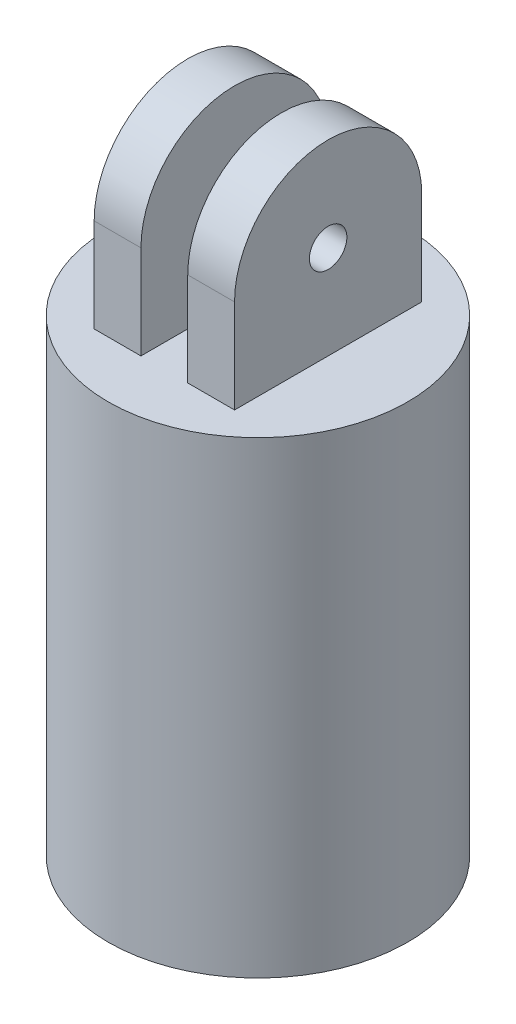
ISO-10303-21;
HEADER;
FILE_DESCRIPTION(('STEP AP214'),'2;1');
FILE_NAME('part.step','',(''),(''),'','','');
FILE_SCHEMA(('AUTOMOTIVE_DESIGN { 1 0 10303 214 1 1 1 1 }'));
ENDSEC;
DATA;
#1=APPLICATION_CONTEXT('core data for automotive mechanical design processes');
#2=APPLICATION_PROTOCOL_DEFINITION('international standard','automotive_design',2000,#1);
#3=PRODUCT_CONTEXT('',#1,'mechanical');
#4=PRODUCT('Part','Part','',(#3));
#5=PRODUCT_RELATED_PRODUCT_CATEGORY('part','',(#4));
#6=PRODUCT_DEFINITION_FORMATION('','',#4);
#7=PRODUCT_DEFINITION_CONTEXT('part definition',#1,'design');
#8=PRODUCT_DEFINITION('design','',#6,#7);
#9=PRODUCT_DEFINITION_SHAPE('','',#8);
#10=(LENGTH_UNIT() NAMED_UNIT(*) SI_UNIT(.MILLI.,.METRE.));
#11=(NAMED_UNIT(*) PLANE_ANGLE_UNIT() SI_UNIT($,.RADIAN.));
#12=(NAMED_UNIT(*) SI_UNIT($,.STERADIAN.) SOLID_ANGLE_UNIT());
#13=UNCERTAINTY_MEASURE_WITH_UNIT(LENGTH_MEASURE(1.E-05),#10,'distance_accuracy_value','');
#14=(GEOMETRIC_REPRESENTATION_CONTEXT(3) GLOBAL_UNCERTAINTY_ASSIGNED_CONTEXT((#13)) GLOBAL_UNIT_ASSIGNED_CONTEXT((#10,
#11,#12)) REPRESENTATION_CONTEXT('',''));
#15=CARTESIAN_POINT('',(0.,0.,0.));
#16=DIRECTION('',(0.,0.,1.));
#17=DIRECTION('',(1.,0.,0.));
#18=AXIS2_PLACEMENT_3D('',#15,#16,#17);
#19=CARTESIAN_POINT('',(-7.5,70.,0.));
#20=DIRECTION('',(1.,0.,0.));
#21=DIRECTION('',(0.,0.,-1.));
#22=AXIS2_PLACEMENT_3D('',#19,#20,#21);
#23=PLANE('',#22);
#24=DIRECTION('',(0.,-1.,0.));
#25=VECTOR('',#24,1.);
#26=CARTESIAN_POINT('',(-7.5,70.,10.));
#27=LINE('',#26,#25);
#28=CARTESIAN_POINT('',(-7.5,60.,10.));
#29=VERTEX_POINT('',#28);
#30=CARTESIAN_POINT('',(-7.5,50.,10.));
#31=VERTEX_POINT('',#30);
#32=EDGE_CURVE('E237',#29,#31,#27,.T.);
#33=ORIENTED_EDGE('',*,*,#32,.F.);
#34=CARTESIAN_POINT('',(-7.5,60.,0.));
#35=DIRECTION('',(1.,0.,0.));
#36=DIRECTION('',(0.,0.,-1.));
#37=AXIS2_PLACEMENT_3D('',#34,#35,#36);
#38=CIRCLE('',#37,9.99999999999999);
#39=CARTESIAN_POINT('',(-7.5,59.9999999999081,-10.));
#40=VERTEX_POINT('',#39);
#41=EDGE_CURVE('E299',#29,#40,#38,.F.);
#42=ORIENTED_EDGE('',*,*,#41,.T.);
#43=DIRECTION('',(0.,-1.,0.));
#44=VECTOR('',#43,1.);
#45=CARTESIAN_POINT('',(-7.5,70.,-10.));
#46=LINE('',#45,#44);
#47=CARTESIAN_POINT('',(-7.5,50.,-10.));
#48=VERTEX_POINT('',#47);
#49=EDGE_CURVE('E232',#40,#48,#46,.T.);
#50=ORIENTED_EDGE('',*,*,#49,.T.);
#51=DIRECTION('',(0.,0.,1.));
#52=VECTOR('',#51,1.);
#53=CARTESIAN_POINT('',(-7.5,50.,0.));
#54=LINE('',#53,#52);
#55=EDGE_CURVE('E217',#48,#31,#54,.T.);
#56=ORIENTED_EDGE('',*,*,#55,.T.);
#57=EDGE_LOOP('',(#33,#42,#50,#56));
#58=FACE_BOUND('',#57,.T.);
#59=CARTESIAN_POINT('',(-7.5,60.,0.));
#60=DIRECTION('',(1.,0.,0.));
#61=DIRECTION('',(0.,0.,-1.));
#62=AXIS2_PLACEMENT_3D('',#59,#60,#61);
#63=CIRCLE('',#62,1.99999999997314);
#64=CARTESIAN_POINT('',(-7.5,60.,-1.99999999997315));
#65=VERTEX_POINT('',#64);
#66=EDGE_CURVE('E202',#65,#65,#63,.F.);
#67=ORIENTED_EDGE('',*,*,#66,.F.);
#68=EDGE_LOOP('',(#67));
#69=FACE_BOUND('',#68,.T.);
#70=ADVANCED_FACE('F121',(#58,#69),#23,.F.);
#71=CARTESIAN_POINT('',(0.,70.,10.));
#72=DIRECTION('',(0.,0.,-1.));
#73=DIRECTION('',(-1.,0.,0.));
#74=AXIS2_PLACEMENT_3D('',#71,#72,#73);
#75=PLANE('',#74);
#76=DIRECTION('',(1.,0.,0.));
#77=VECTOR('',#76,1.);
#78=CARTESIAN_POINT('',(-12.5,60.,10.));
#79=LINE('',#78,#77);
#80=CARTESIAN_POINT('',(-2.5,60.,10.));
#81=VERTEX_POINT('',#80);
#82=EDGE_CURVE('E210',#29,#81,#79,.T.);
#83=ORIENTED_EDGE('',*,*,#82,.F.);
#84=ORIENTED_EDGE('',*,*,#32,.T.);
#85=DIRECTION('',(1.,0.,0.));
#86=VECTOR('',#85,1.);
#87=CARTESIAN_POINT('',(0.,50.,10.));
#88=LINE('',#87,#86);
#89=CARTESIAN_POINT('',(-2.5,50.,10.));
#90=VERTEX_POINT('',#89);
#91=EDGE_CURVE('E220',#31,#90,#88,.T.);
#92=ORIENTED_EDGE('',*,*,#91,.T.);
#93=DIRECTION('',(0.,-1.,0.));
#94=VECTOR('',#93,1.);
#95=CARTESIAN_POINT('',(-2.5,70.,10.));
#96=LINE('',#95,#94);
#97=EDGE_CURVE('E235',#81,#90,#96,.T.);
#98=ORIENTED_EDGE('',*,*,#97,.F.);
#99=EDGE_LOOP('',(#83,#84,#92,#98));
#100=FACE_BOUND('',#99,.T.);
#101=ADVANCED_FACE('F263',(#100),#75,.F.);
#102=CARTESIAN_POINT('',(-2.5,70.,0.));
#103=DIRECTION('',(1.,0.,0.));
#104=DIRECTION('',(0.,0.,-1.));
#105=AXIS2_PLACEMENT_3D('',#102,#103,#104);
#106=PLANE('',#105);
#107=CARTESIAN_POINT('',(-2.5,60.,0.));
#108=DIRECTION('',(1.,0.,0.));
#109=DIRECTION('',(0.,0.,-1.));
#110=AXIS2_PLACEMENT_3D('',#107,#108,#109);
#111=CIRCLE('',#110,9.99999999999999);
#112=CARTESIAN_POINT('',(-2.5,59.9999999999081,-10.));
#113=VERTEX_POINT('',#112);
#114=EDGE_CURVE('E305',#81,#113,#111,.F.);
#115=ORIENTED_EDGE('',*,*,#114,.F.);
#116=ORIENTED_EDGE('',*,*,#97,.T.);
#117=DIRECTION('',(0.,0.,1.));
#118=VECTOR('',#117,1.);
#119=CARTESIAN_POINT('',(-2.5,50.,0.));
#120=LINE('',#119,#118);
#121=CARTESIAN_POINT('',(-2.5,50.,-10.));
#122=VERTEX_POINT('',#121);
#123=EDGE_CURVE('E227',#122,#90,#120,.T.);
#124=ORIENTED_EDGE('',*,*,#123,.F.);
#125=DIRECTION('',(0.,-1.,0.));
#126=VECTOR('',#125,1.);
#127=CARTESIAN_POINT('',(-2.5,70.,-10.));
#128=LINE('',#127,#126);
#129=EDGE_CURVE('E145',#113,#122,#128,.T.);
#130=ORIENTED_EDGE('',*,*,#129,.F.);
#131=EDGE_LOOP('',(#115,#116,#124,#130));
#132=FACE_BOUND('',#131,.T.);
#133=CARTESIAN_POINT('',(-2.5,60.,0.));
#134=DIRECTION('',(1.,0.,0.));
#135=DIRECTION('',(0.,0.,-1.));
#136=AXIS2_PLACEMENT_3D('',#133,#134,#135);
#137=CIRCLE('',#136,1.99999999997314);
#138=CARTESIAN_POINT('',(-2.5,60.,-1.99999999997315));
#139=VERTEX_POINT('',#138);
#140=EDGE_CURVE('E309',#139,#139,#137,.F.);
#141=ORIENTED_EDGE('',*,*,#140,.T.);
#142=EDGE_LOOP('',(#141));
#143=FACE_BOUND('',#142,.T.);
#144=ADVANCED_FACE('F269',(#132,#143),#106,.T.);
#145=CARTESIAN_POINT('',(7.5,70.,0.));
#146=DIRECTION('',(1.,0.,0.));
#147=DIRECTION('',(0.,0.,-1.));
#148=AXIS2_PLACEMENT_3D('',#145,#146,#147);
#149=PLANE('',#148);
#150=CARTESIAN_POINT('',(7.49999999999999,60.,0.));
#151=DIRECTION('',(-1.,0.,0.));
#152=DIRECTION('',(0.,0.,1.));
#153=AXIS2_PLACEMENT_3D('',#150,#151,#152);
#154=CIRCLE('',#153,9.99999999999999);
#155=CARTESIAN_POINT('',(7.49999999999999,60.,10.));
#156=VERTEX_POINT('',#155);
#157=CARTESIAN_POINT('',(7.49999999999999,59.9999999999081,-10.));
#158=VERTEX_POINT('',#157);
#159=EDGE_CURVE('E190',#156,#158,#154,.T.);
#160=ORIENTED_EDGE('',*,*,#159,.F.);
#161=DIRECTION('',(0.,-1.,0.));
#162=VECTOR('',#161,1.);
#163=CARTESIAN_POINT('',(7.5,70.,10.));
#164=LINE('',#163,#162);
#165=CARTESIAN_POINT('',(7.5,50.,10.));
#166=VERTEX_POINT('',#165);
#167=EDGE_CURVE('E196',#156,#166,#164,.T.);
#168=ORIENTED_EDGE('',*,*,#167,.T.);
#169=DIRECTION('',(0.,0.,1.));
#170=VECTOR('',#169,1.);
#171=CARTESIAN_POINT('',(7.5,50.,0.));
#172=LINE('',#171,#170);
#173=CARTESIAN_POINT('',(7.5,50.,-10.));
#174=VERTEX_POINT('',#173);
#175=EDGE_CURVE('E319',#174,#166,#172,.T.);
#176=ORIENTED_EDGE('',*,*,#175,.F.);
#177=DIRECTION('',(0.,-1.,0.));
#178=VECTOR('',#177,1.);
#179=CARTESIAN_POINT('',(7.5,70.,-10.));
#180=LINE('',#179,#178);
#181=EDGE_CURVE('E198',#158,#174,#180,.T.);
#182=ORIENTED_EDGE('',*,*,#181,.F.);
#183=EDGE_LOOP('',(#160,#168,#176,#182));
#184=FACE_BOUND('',#183,.T.);
#185=CARTESIAN_POINT('',(7.49999999999999,60.,0.));
#186=DIRECTION('',(-1.,0.,0.));
#187=DIRECTION('',(0.,0.,1.));
#188=AXIS2_PLACEMENT_3D('',#185,#186,#187);
#189=CIRCLE('',#188,1.99999999997314);
#190=CARTESIAN_POINT('',(7.49999999999999,60.,1.99999999997313));
#191=VERTEX_POINT('',#190);
#192=EDGE_CURVE('E211',#191,#191,#189,.T.);
#193=ORIENTED_EDGE('',*,*,#192,.T.);
#194=EDGE_LOOP('',(#193));
#195=FACE_BOUND('',#194,.T.);
#196=ADVANCED_FACE('F192',(#184,#195),#149,.T.);
#197=CARTESIAN_POINT('',(2.5,70.,0.));
#198=DIRECTION('',(1.,0.,0.));
#199=DIRECTION('',(0.,0.,-1.));
#200=AXIS2_PLACEMENT_3D('',#197,#198,#199);
#201=PLANE('',#200);
#202=DIRECTION('',(0.,-1.,0.));
#203=VECTOR('',#202,1.);
#204=CARTESIAN_POINT('',(2.5,70.,10.));
#205=LINE('',#204,#203);
#206=CARTESIAN_POINT('',(2.5,60.,10.));
#207=VERTEX_POINT('',#206);
#208=CARTESIAN_POINT('',(2.5,50.,10.));
#209=VERTEX_POINT('',#208);
#210=EDGE_CURVE('E326',#207,#209,#205,.T.);
#211=ORIENTED_EDGE('',*,*,#210,.F.);
#212=CARTESIAN_POINT('',(2.5,60.,0.));
#213=DIRECTION('',(1.,0.,0.));
#214=DIRECTION('',(0.,0.,-1.));
#215=AXIS2_PLACEMENT_3D('',#212,#213,#214);
#216=CIRCLE('',#215,9.99999999999999);
#217=CARTESIAN_POINT('',(2.5,59.9999999999081,-10.));
#218=VERTEX_POINT('',#217);
#219=EDGE_CURVE('E207',#207,#218,#216,.F.);
#220=ORIENTED_EDGE('',*,*,#219,.T.);
#221=DIRECTION('',(0.,-1.,0.));
#222=VECTOR('',#221,1.);
#223=CARTESIAN_POINT('',(2.5,70.,-10.));
#224=LINE('',#223,#222);
#225=CARTESIAN_POINT('',(2.5,50.,-10.));
#226=VERTEX_POINT('',#225);
#227=EDGE_CURVE('E137',#218,#226,#224,.T.);
#228=ORIENTED_EDGE('',*,*,#227,.T.);
#229=DIRECTION('',(0.,0.,1.));
#230=VECTOR('',#229,1.);
#231=CARTESIAN_POINT('',(2.5,50.,0.));
#232=LINE('',#231,#230);
#233=EDGE_CURVE('E324',#226,#209,#232,.T.);
#234=ORIENTED_EDGE('',*,*,#233,.T.);
#235=EDGE_LOOP('',(#211,#220,#228,#234));
#236=FACE_BOUND('',#235,.T.);
#237=CARTESIAN_POINT('',(2.5,60.,0.));
#238=DIRECTION('',(1.,0.,0.));
#239=DIRECTION('',(0.,0.,-1.));
#240=AXIS2_PLACEMENT_3D('',#237,#238,#239);
#241=CIRCLE('',#240,1.99999999997314);
#242=CARTESIAN_POINT('',(2.5,60.,-1.99999999997315));
#243=VERTEX_POINT('',#242);
#244=EDGE_CURVE('E125',#243,#243,#241,.F.);
#245=ORIENTED_EDGE('',*,*,#244,.F.);
#246=EDGE_LOOP('',(#245));
#247=FACE_BOUND('',#246,.T.);
#248=ADVANCED_FACE('F285',(#236,#247),#201,.F.);
#249=CARTESIAN_POINT('',(0.,70.,-10.));
#250=DIRECTION('',(0.,0.,1.));
#251=DIRECTION('',(1.,0.,0.));
#252=AXIS2_PLACEMENT_3D('',#249,#250,#251);
#253=PLANE('',#252);
#254=DIRECTION('',(1.,0.,0.));
#255=VECTOR('',#254,1.);
#256=CARTESIAN_POINT('',(-12.5,59.9999999999081,-10.));
#257=LINE('',#256,#255);
#258=EDGE_CURVE('E300',#40,#113,#257,.T.);
#259=ORIENTED_EDGE('',*,*,#258,.T.);
#260=ORIENTED_EDGE('',*,*,#129,.T.);
#261=DIRECTION('',(-1.,0.,0.));
#262=VECTOR('',#261,1.);
#263=CARTESIAN_POINT('',(0.,50.,-10.));
#264=LINE('',#263,#262);
#265=EDGE_CURVE('E230',#122,#48,#264,.T.);
#266=ORIENTED_EDGE('',*,*,#265,.T.);
#267=ORIENTED_EDGE('',*,*,#49,.F.);
#268=EDGE_LOOP('',(#259,#260,#266,#267));
#269=FACE_BOUND('',#268,.T.);
#270=ADVANCED_FACE('F278',(#269),#253,.F.);
#271=CARTESIAN_POINT('',(0.,50.,0.));
#272=DIRECTION('',(0.,1.,0.));
#273=DIRECTION('',(0.,0.,1.));
#274=AXIS2_PLACEMENT_3D('',#271,#272,#273);
#275=PLANE('',#274);
#276=DIRECTION('',(-1.,0.,0.));
#277=VECTOR('',#276,1.);
#278=CARTESIAN_POINT('',(0.,50.,10.));
#279=LINE('',#278,#277);
#280=EDGE_CURVE('E215',#166,#209,#279,.T.);
#281=ORIENTED_EDGE('',*,*,#280,.T.);
#282=ORIENTED_EDGE('',*,*,#233,.F.);
#283=DIRECTION('',(1.,0.,0.));
#284=VECTOR('',#283,1.);
#285=CARTESIAN_POINT('',(0.,50.,-10.));
#286=LINE('',#285,#284);
#287=EDGE_CURVE('E321',#226,#174,#286,.T.);
#288=ORIENTED_EDGE('',*,*,#287,.T.);
#289=ORIENTED_EDGE('',*,*,#175,.T.);
#290=EDGE_LOOP('',(#281,#282,#288,#289));
#291=FACE_BOUND('',#290,.T.);
#292=CARTESIAN_POINT('',(0.,50.,0.));
#293=DIRECTION('',(0.,1.,0.));
#294=DIRECTION('',(0.,0.,1.));
#295=AXIS2_PLACEMENT_3D('',#292,#293,#294);
#296=CIRCLE('',#295,16.);
#297=CARTESIAN_POINT('',(0.,50.,16.));
#298=VERTEX_POINT('',#297);
#299=EDGE_CURVE('E239',#298,#298,#296,.T.);
#300=ORIENTED_EDGE('',*,*,#299,.T.);
#301=EDGE_LOOP('',(#300));
#302=FACE_BOUND('',#301,.T.);
#303=ORIENTED_EDGE('',*,*,#91,.F.);
#304=ORIENTED_EDGE('',*,*,#55,.F.);
#305=ORIENTED_EDGE('',*,*,#265,.F.);
#306=ORIENTED_EDGE('',*,*,#123,.T.);
#307=EDGE_LOOP('',(#303,#304,#305,#306));
#308=FACE_BOUND('',#307,.T.);
#309=ADVANCED_FACE('F276',(#291,#302,#308),#275,.T.);
#310=CARTESIAN_POINT('',(0.,0.,0.));
#311=DIRECTION('',(0.,1.,0.));
#312=DIRECTION('',(0.,0.,1.));
#313=AXIS2_PLACEMENT_3D('',#310,#311,#312);
#314=PLANE('',#313);
#315=CARTESIAN_POINT('',(0.,0.,0.));
#316=DIRECTION('',(0.,1.,0.));
#317=DIRECTION('',(0.,0.,1.));
#318=AXIS2_PLACEMENT_3D('',#315,#316,#317);
#319=CIRCLE('',#318,16.);
#320=CARTESIAN_POINT('',(0.,0.,16.));
#321=VERTEX_POINT('',#320);
#322=EDGE_CURVE('E12',#321,#321,#319,.T.);
#323=ORIENTED_EDGE('',*,*,#322,.F.);
#324=EDGE_LOOP('',(#323));
#325=FACE_BOUND('',#324,.T.);
#326=CARTESIAN_POINT('',(0.,0.,0.));
#327=DIRECTION('',(0.,1.,0.));
#328=DIRECTION('',(0.,0.,1.));
#329=AXIS2_PLACEMENT_3D('',#326,#327,#328);
#330=CIRCLE('',#329,12.7);
#331=CARTESIAN_POINT('',(0.,0.,12.7));
#332=VERTEX_POINT('',#331);
#333=EDGE_CURVE('E130',#332,#332,#330,.T.);
#334=ORIENTED_EDGE('',*,*,#333,.T.);
#335=EDGE_LOOP('',(#334));
#336=FACE_BOUND('',#335,.T.);
#337=ADVANCED_FACE('F248',(#325,#336),#314,.F.);
#338=CARTESIAN_POINT('',(0.,40.,0.));
#339=DIRECTION('',(0.,-1.,0.));
#340=DIRECTION('',(0.,0.,-1.));
#341=AXIS2_PLACEMENT_3D('',#338,#339,#340);
#342=CYLINDRICAL_SURFACE('',#341,16.);
#343=ORIENTED_EDGE('',*,*,#322,.T.);
#344=EDGE_LOOP('',(#343));
#345=FACE_BOUND('',#344,.T.);
#346=ORIENTED_EDGE('',*,*,#299,.F.);
#347=EDGE_LOOP('',(#346));
#348=FACE_BOUND('',#347,.T.);
#349=ADVANCED_FACE('F123',(#345,#348),#342,.T.);
#350=CARTESIAN_POINT('',(0.,40.,0.));
#351=DIRECTION('',(0.,-1.,0.));
#352=DIRECTION('',(0.,0.,-1.));
#353=AXIS2_PLACEMENT_3D('',#350,#351,#352);
#354=CYLINDRICAL_SURFACE('',#353,12.7);
#355=CARTESIAN_POINT('',(0.,40.,0.));
#356=DIRECTION('',(0.,1.,0.));
#357=DIRECTION('',(0.,0.,1.));
#358=AXIS2_PLACEMENT_3D('',#355,#356,#357);
#359=CIRCLE('',#358,12.7);
#360=CARTESIAN_POINT('',(0.,40.,12.7));
#361=VERTEX_POINT('',#360);
#362=EDGE_CURVE('E242',#361,#361,#359,.T.);
#363=ORIENTED_EDGE('',*,*,#362,.T.);
#364=EDGE_LOOP('',(#363));
#365=FACE_BOUND('',#364,.T.);
#366=ORIENTED_EDGE('',*,*,#333,.F.);
#367=EDGE_LOOP('',(#366));
#368=FACE_BOUND('',#367,.T.);
#369=ADVANCED_FACE('F250',(#365,#368),#354,.F.);
#370=CARTESIAN_POINT('',(0.,40.,0.));
#371=DIRECTION('',(0.,1.,0.));
#372=DIRECTION('',(0.,0.,1.));
#373=AXIS2_PLACEMENT_3D('',#370,#371,#372);
#374=PLANE('',#373);
#375=ORIENTED_EDGE('',*,*,#362,.F.);
#376=EDGE_LOOP('',(#375));
#377=FACE_BOUND('',#376,.T.);
#378=ADVANCED_FACE('F252',(#377),#374,.F.);
#379=CARTESIAN_POINT('',(0.,70.,10.));
#380=DIRECTION('',(0.,0.,1.));
#381=DIRECTION('',(1.,0.,0.));
#382=AXIS2_PLACEMENT_3D('',#379,#380,#381);
#383=PLANE('',#382);
#384=EDGE_CURVE('E205',#207,#156,#79,.T.);
#385=ORIENTED_EDGE('',*,*,#384,.F.);
#386=ORIENTED_EDGE('',*,*,#210,.T.);
#387=ORIENTED_EDGE('',*,*,#280,.F.);
#388=ORIENTED_EDGE('',*,*,#167,.F.);
#389=EDGE_LOOP('',(#385,#386,#387,#388));
#390=FACE_BOUND('',#389,.T.);
#391=ADVANCED_FACE('F213',(#390),#383,.T.);
#392=CARTESIAN_POINT('',(0.,70.,-10.));
#393=DIRECTION('',(0.,0.,-1.));
#394=DIRECTION('',(-1.,0.,0.));
#395=AXIS2_PLACEMENT_3D('',#392,#393,#394);
#396=PLANE('',#395);
#397=EDGE_CURVE('E201',#218,#158,#257,.T.);
#398=ORIENTED_EDGE('',*,*,#397,.T.);
#399=ORIENTED_EDGE('',*,*,#181,.T.);
#400=ORIENTED_EDGE('',*,*,#287,.F.);
#401=ORIENTED_EDGE('',*,*,#227,.F.);
#402=EDGE_LOOP('',(#398,#399,#400,#401));
#403=FACE_BOUND('',#402,.T.);
#404=ADVANCED_FACE('F329',(#403),#396,.T.);
#405=CARTESIAN_POINT('',(-12.5,60.,0.));
#406=DIRECTION('',(1.,0.,0.));
#407=DIRECTION('',(0.,0.,-1.));
#408=AXIS2_PLACEMENT_3D('',#405,#406,#407);
#409=CYLINDRICAL_SURFACE('',#408,9.99999999999999);
#410=ORIENTED_EDGE('',*,*,#219,.F.);
#411=ORIENTED_EDGE('',*,*,#384,.T.);
#412=ORIENTED_EDGE('',*,*,#159,.T.);
#413=ORIENTED_EDGE('',*,*,#397,.F.);
#414=EDGE_LOOP('',(#410,#411,#412,#413));
#415=FACE_BOUND('',#414,.T.);
#416=ADVANCED_FACE('F206',(#415),#409,.T.);
#417=ORIENTED_EDGE('',*,*,#41,.F.);
#418=ORIENTED_EDGE('',*,*,#82,.T.);
#419=ORIENTED_EDGE('',*,*,#114,.T.);
#420=ORIENTED_EDGE('',*,*,#258,.F.);
#421=EDGE_LOOP('',(#417,#418,#419,#420));
#422=FACE_BOUND('',#421,.T.);
#423=ADVANCED_FACE('F307',(#422),#409,.T.);
#424=CARTESIAN_POINT('',(-12.5,60.,0.));
#425=DIRECTION('',(1.,0.,0.));
#426=DIRECTION('',(0.,0.,-1.));
#427=AXIS2_PLACEMENT_3D('',#424,#425,#426);
#428=CYLINDRICAL_SURFACE('',#427,1.99999999997314);
#429=ORIENTED_EDGE('',*,*,#192,.F.);
#430=EDGE_LOOP('',(#429));
#431=FACE_BOUND('',#430,.T.);
#432=ORIENTED_EDGE('',*,*,#244,.T.);
#433=EDGE_LOOP('',(#432));
#434=FACE_BOUND('',#433,.T.);
#435=ADVANCED_FACE('F387',(#431,#434),#428,.F.);
#436=ORIENTED_EDGE('',*,*,#140,.F.);
#437=EDGE_LOOP('',(#436));
#438=FACE_BOUND('',#437,.T.);
#439=ORIENTED_EDGE('',*,*,#66,.T.);
#440=EDGE_LOOP('',(#439));
#441=FACE_BOUND('',#440,.T.);
#442=ADVANCED_FACE('F395',(#438,#441),#428,.F.);
#443=CLOSED_SHELL('',(#70,#101,#144,#196,#248,#270,#309,#337,#349,#369,#378,#391,#404,#416,#423,
#435,#442));
#444=MANIFOLD_SOLID_BREP('B2',#443);
#445=ADVANCED_BREP_SHAPE_REPRESENTATION('',(#18,#444),#14);
#446=SHAPE_DEFINITION_REPRESENTATION(#9,#445);
ENDSEC;
END-ISO-10303-21;
